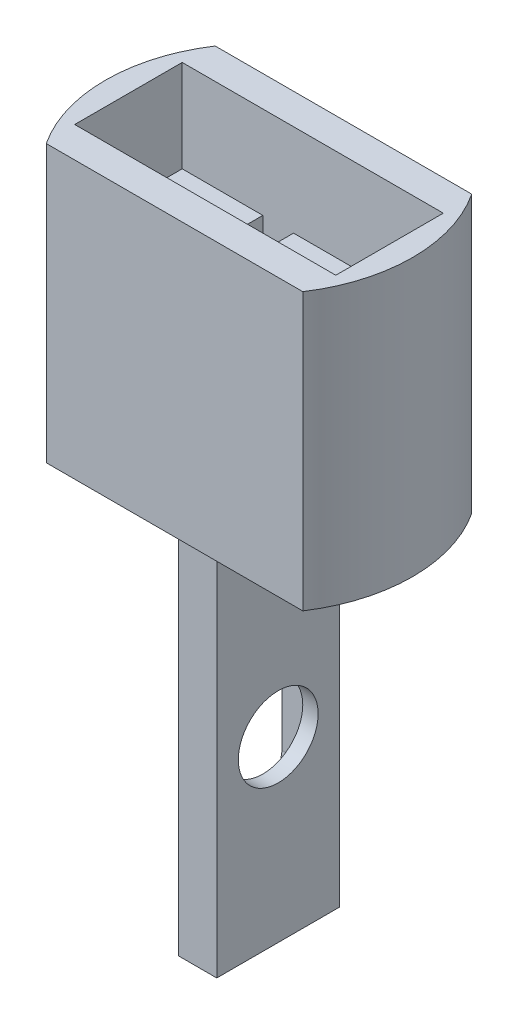
ISO-10303-21;
HEADER;
FILE_DESCRIPTION(('STEP AP214'),'2;1');
FILE_NAME('part.step','',(''),(''),'','','');
FILE_SCHEMA(('AUTOMOTIVE_DESIGN { 1 0 10303 214 1 1 1 1 }'));
ENDSEC;
DATA;
#1=APPLICATION_CONTEXT('core data for automotive mechanical design processes');
#2=APPLICATION_PROTOCOL_DEFINITION('international standard','automotive_design',2000,#1);
#3=PRODUCT_CONTEXT('',#1,'mechanical');
#4=PRODUCT('Part','Part','',(#3));
#5=PRODUCT_RELATED_PRODUCT_CATEGORY('part','',(#4));
#6=PRODUCT_DEFINITION_FORMATION('','',#4);
#7=PRODUCT_DEFINITION_CONTEXT('part definition',#1,'design');
#8=PRODUCT_DEFINITION('design','',#6,#7);
#9=PRODUCT_DEFINITION_SHAPE('','',#8);
#10=(LENGTH_UNIT() NAMED_UNIT(*) SI_UNIT(.MILLI.,.METRE.));
#11=(NAMED_UNIT(*) PLANE_ANGLE_UNIT() SI_UNIT($,.RADIAN.));
#12=(NAMED_UNIT(*) SI_UNIT($,.STERADIAN.) SOLID_ANGLE_UNIT());
#13=UNCERTAINTY_MEASURE_WITH_UNIT(LENGTH_MEASURE(1.E-05),#10,'distance_accuracy_value','');
#14=(GEOMETRIC_REPRESENTATION_CONTEXT(3) GLOBAL_UNCERTAINTY_ASSIGNED_CONTEXT((#13)) GLOBAL_UNIT_ASSIGNED_CONTEXT((#10,
#11,#12)) REPRESENTATION_CONTEXT('',''));
#15=CARTESIAN_POINT('',(0.,0.,0.));
#16=DIRECTION('',(0.,0.,1.));
#17=DIRECTION('',(1.,0.,0.));
#18=AXIS2_PLACEMENT_3D('',#15,#16,#17);
#19=CARTESIAN_POINT('',(0.249999999999999,-2.9,2.75));
#20=DIRECTION('',(0.,1.,0.));
#21=DIRECTION('',(0.,0.,1.));
#22=AXIS2_PLACEMENT_3D('',#19,#20,#21);
#23=PLANE('',#22);
#24=DIRECTION('',(0.,0.,-1.));
#25=VECTOR('',#24,1.);
#26=CARTESIAN_POINT('',(-1.25,-2.9,2.75));
#27=LINE('',#26,#25);
#28=CARTESIAN_POINT('',(-1.25,-2.9,1.49997066480721));
#29=VERTEX_POINT('',#28);
#30=CARTESIAN_POINT('',(-1.25,-2.9,-1.49997066480721));
#31=VERTEX_POINT('',#30);
#32=EDGE_CURVE('E64',#29,#31,#27,.T.);
#33=ORIENTED_EDGE('',*,*,#32,.T.);
#34=DIRECTION('',(-1.,0.,0.));
#35=VECTOR('',#34,1.);
#36=CARTESIAN_POINT('',(0.249999999999999,-2.9,-1.49997066480721));
#37=LINE('',#36,#35);
#38=CARTESIAN_POINT('',(0.249999999999999,-2.9,-1.49997066480721));
#39=VERTEX_POINT('',#38);
#40=EDGE_CURVE('E277',#39,#31,#37,.T.);
#41=ORIENTED_EDGE('',*,*,#40,.F.);
#42=DIRECTION('',(0.,0.,-1.));
#43=VECTOR('',#42,1.);
#44=CARTESIAN_POINT('',(0.249999999999999,-2.9,2.75));
#45=LINE('',#44,#43);
#46=CARTESIAN_POINT('',(0.249999999999999,-2.9,1.49997066480721));
#47=VERTEX_POINT('',#46);
#48=EDGE_CURVE('E405',#47,#39,#45,.T.);
#49=ORIENTED_EDGE('',*,*,#48,.F.);
#50=DIRECTION('',(-1.,0.,0.));
#51=VECTOR('',#50,1.);
#52=CARTESIAN_POINT('',(0.249999999999999,-2.9,1.49997066480721));
#53=LINE('',#52,#51);
#54=EDGE_CURVE('E305',#47,#29,#53,.T.);
#55=ORIENTED_EDGE('',*,*,#54,.T.);
#56=EDGE_LOOP('',(#33,#41,#49,#55));
#57=FACE_BOUND('',#56,.T.);
#58=ADVANCED_FACE('F40',(#57),#23,.F.);
#59=CARTESIAN_POINT('',(-1.25,-2.9,2.75));
#60=VERTEX_POINT('',#59);
#61=CARTESIAN_POINT('',(-1.25,-2.9,2.7499706648072));
#62=VERTEX_POINT('',#61);
#63=EDGE_CURVE('E267',#60,#62,#27,.T.);
#64=ORIENTED_EDGE('',*,*,#63,.T.);
#65=DIRECTION('',(-1.,0.,0.));
#66=VECTOR('',#65,1.);
#67=CARTESIAN_POINT('',(0.249999999999999,-2.9,2.7499706648072));
#68=LINE('',#67,#66);
#69=CARTESIAN_POINT('',(0.249999999999999,-2.9,2.7499706648072));
#70=VERTEX_POINT('',#69);
#71=EDGE_CURVE('E312',#70,#62,#68,.T.);
#72=ORIENTED_EDGE('',*,*,#71,.F.);
#73=CARTESIAN_POINT('',(0.249999999999999,-2.9,2.75));
#74=VERTEX_POINT('',#73);
#75=EDGE_CURVE('E400',#74,#70,#45,.T.);
#76=ORIENTED_EDGE('',*,*,#75,.F.);
#77=DIRECTION('',(-1.,0.,0.));
#78=VECTOR('',#77,1.);
#79=CARTESIAN_POINT('',(0.249999999999999,-2.9,2.75));
#80=LINE('',#79,#78);
#81=EDGE_CURVE('E414',#74,#60,#80,.T.);
#82=ORIENTED_EDGE('',*,*,#81,.T.);
#83=EDGE_LOOP('',(#64,#72,#76,#82));
#84=FACE_BOUND('',#83,.T.);
#85=ADVANCED_FACE('F660',(#84),#23,.F.);
#86=CARTESIAN_POINT('',(0.249999999999999,-23.9,2.75));
#87=DIRECTION('',(0.,-1.,0.));
#88=DIRECTION('',(0.,0.,-1.));
#89=AXIS2_PLACEMENT_3D('',#86,#87,#88);
#90=PLANE('',#89);
#91=DIRECTION('',(0.,0.,1.));
#92=VECTOR('',#91,1.);
#93=CARTESIAN_POINT('',(-1.25,-23.9,2.75));
#94=LINE('',#93,#92);
#95=CARTESIAN_POINT('',(-1.25,-23.9,-1.49997066480721));
#96=VERTEX_POINT('',#95);
#97=CARTESIAN_POINT('',(-1.25,-23.9,1.49997066480721));
#98=VERTEX_POINT('',#97);
#99=EDGE_CURVE('E424',#96,#98,#94,.T.);
#100=ORIENTED_EDGE('',*,*,#99,.T.);
#101=DIRECTION('',(-1.,0.,0.));
#102=VECTOR('',#101,1.);
#103=CARTESIAN_POINT('',(0.249999999999999,-23.9,1.49997066480721));
#104=LINE('',#103,#102);
#105=CARTESIAN_POINT('',(0.249999999999999,-23.9,1.49997066480721));
#106=VERTEX_POINT('',#105);
#107=EDGE_CURVE('E331',#106,#98,#104,.T.);
#108=ORIENTED_EDGE('',*,*,#107,.F.);
#109=DIRECTION('',(0.,0.,1.));
#110=VECTOR('',#109,1.);
#111=CARTESIAN_POINT('',(0.249999999999999,-23.9,2.75));
#112=LINE('',#111,#110);
#113=CARTESIAN_POINT('',(0.249999999999999,-23.9,-1.49997066480721));
#114=VERTEX_POINT('',#113);
#115=EDGE_CURVE('E415',#114,#106,#112,.T.);
#116=ORIENTED_EDGE('',*,*,#115,.F.);
#117=DIRECTION('',(-1.,0.,0.));
#118=VECTOR('',#117,1.);
#119=CARTESIAN_POINT('',(0.249999999999999,-23.9,-1.49997066480721));
#120=LINE('',#119,#118);
#121=EDGE_CURVE('E358',#114,#96,#120,.T.);
#122=ORIENTED_EDGE('',*,*,#121,.T.);
#123=EDGE_LOOP('',(#100,#108,#116,#122));
#124=FACE_BOUND('',#123,.T.);
#125=ADVANCED_FACE('F630',(#124),#90,.F.);
#126=CARTESIAN_POINT('',(-1.25,-23.9,-2.75));
#127=VERTEX_POINT('',#126);
#128=CARTESIAN_POINT('',(-1.25,-23.9,-2.7499706648072));
#129=VERTEX_POINT('',#128);
#130=EDGE_CURVE('E399',#127,#129,#94,.T.);
#131=ORIENTED_EDGE('',*,*,#130,.T.);
#132=DIRECTION('',(-1.,0.,0.));
#133=VECTOR('',#132,1.);
#134=CARTESIAN_POINT('',(0.249999999999999,-23.9,-2.7499706648072));
#135=LINE('',#134,#133);
#136=CARTESIAN_POINT('',(0.249999999999999,-23.9,-2.7499706648072));
#137=VERTEX_POINT('',#136);
#138=EDGE_CURVE('E365',#137,#129,#135,.T.);
#139=ORIENTED_EDGE('',*,*,#138,.F.);
#140=CARTESIAN_POINT('',(0.249999999999999,-23.9,-2.75));
#141=VERTEX_POINT('',#140);
#142=EDGE_CURVE('E410',#141,#137,#112,.T.);
#143=ORIENTED_EDGE('',*,*,#142,.F.);
#144=DIRECTION('',(-1.,0.,0.));
#145=VECTOR('',#144,1.);
#146=CARTESIAN_POINT('',(0.249999999999999,-23.9,-2.75));
#147=LINE('',#146,#145);
#148=EDGE_CURVE('E430',#141,#127,#147,.T.);
#149=ORIENTED_EDGE('',*,*,#148,.T.);
#150=EDGE_LOOP('',(#131,#139,#143,#149));
#151=FACE_BOUND('',#150,.T.);
#152=ADVANCED_FACE('F619',(#151),#90,.F.);
#153=CARTESIAN_POINT('',(0.,18.,0.));
#154=DIRECTION('',(0.,-1.,0.));
#155=DIRECTION('',(0.,0.,-1.));
#156=AXIS2_PLACEMENT_3D('',#153,#154,#155);
#157=CYLINDRICAL_SURFACE('',#156,10.);
#158=CARTESIAN_POINT('',(0.,18.,0.));
#159=DIRECTION('',(0.,1.,0.));
#160=DIRECTION('',(0.,0.,1.));
#161=AXIS2_PLACEMENT_3D('',#158,#159,#160);
#162=CIRCLE('',#161,10.);
#163=CARTESIAN_POINT('',(-8.35164654424503,18.,-5.5));
#164=VERTEX_POINT('',#163);
#165=CARTESIAN_POINT('',(-8.35164654424503,18.,5.5));
#166=VERTEX_POINT('',#165);
#167=EDGE_CURVE('E575',#164,#166,#162,.T.);
#168=ORIENTED_EDGE('',*,*,#167,.F.);
#169=DIRECTION('',(0.,-1.,0.));
#170=VECTOR('',#169,1.);
#171=CARTESIAN_POINT('',(-8.35164654424503,43.,-5.5));
#172=LINE('',#171,#170);
#173=CARTESIAN_POINT('',(-8.35164654424503,0.,-5.5));
#174=VERTEX_POINT('',#173);
#175=EDGE_CURVE('E381',#164,#174,#172,.T.);
#176=ORIENTED_EDGE('',*,*,#175,.T.);
#177=CARTESIAN_POINT('',(0.,0.,0.));
#178=DIRECTION('',(0.,1.,0.));
#179=DIRECTION('',(0.,0.,1.));
#180=AXIS2_PLACEMENT_3D('',#177,#178,#179);
#181=CIRCLE('',#180,10.);
#182=CARTESIAN_POINT('',(-8.35164654424503,0.,5.5));
#183=VERTEX_POINT('',#182);
#184=EDGE_CURVE('E570',#174,#183,#181,.T.);
#185=ORIENTED_EDGE('',*,*,#184,.T.);
#186=DIRECTION('',(0.,-1.,0.));
#187=VECTOR('',#186,1.);
#188=CARTESIAN_POINT('',(-8.35164654424503,43.,5.5));
#189=LINE('',#188,#187);
#190=EDGE_CURVE('E389',#166,#183,#189,.T.);
#191=ORIENTED_EDGE('',*,*,#190,.F.);
#192=EDGE_LOOP('',(#168,#176,#185,#191));
#193=FACE_BOUND('',#192,.T.);
#194=ADVANCED_FACE('F594',(#193),#157,.T.);
#195=CARTESIAN_POINT('',(-10.001,-13.4,0.));
#196=DIRECTION('',(1.,0.,0.));
#197=DIRECTION('',(0.,0.,-1.));
#198=AXIS2_PLACEMENT_3D('',#195,#196,#197);
#199=CYLINDRICAL_SURFACE('',#198,2.6);
#200=CARTESIAN_POINT('',(1.25,-13.4,0.));
#201=DIRECTION('',(1.,0.,0.));
#202=DIRECTION('',(0.,0.,-1.));
#203=AXIS2_PLACEMENT_3D('',#200,#201,#202);
#204=CIRCLE('',#203,2.6);
#205=CARTESIAN_POINT('',(1.25,-13.4,-2.6));
#206=VERTEX_POINT('',#205);
#207=EDGE_CURVE('E512',#206,#206,#204,.T.);
#208=ORIENTED_EDGE('',*,*,#207,.T.);
#209=EDGE_LOOP('',(#208));
#210=FACE_BOUND('',#209,.T.);
#211=CARTESIAN_POINT('',(0.249999999999999,-13.4,0.));
#212=DIRECTION('',(-1.,0.,0.));
#213=DIRECTION('',(0.,0.,1.));
#214=AXIS2_PLACEMENT_3D('',#211,#212,#213);
#215=CIRCLE('',#214,2.6);
#216=CARTESIAN_POINT('',(0.249999999999998,-13.4,2.6));
#217=VERTEX_POINT('',#216);
#218=EDGE_CURVE('E429',#217,#217,#215,.F.);
#219=ORIENTED_EDGE('',*,*,#218,.F.);
#220=EDGE_LOOP('',(#219));
#221=FACE_BOUND('',#220,.T.);
#222=ADVANCED_FACE('F779',(#210,#221),#199,.F.);
#223=CARTESIAN_POINT('',(0.,12.,0.));
#224=DIRECTION('',(0.,-1.,0.));
#225=DIRECTION('',(0.,0.,-1.));
#226=AXIS2_PLACEMENT_3D('',#223,#224,#225);
#227=PLANE('',#226);
#228=DIRECTION('',(0.,0.,-1.));
#229=VECTOR('',#228,1.);
#230=CARTESIAN_POINT('',(-1.25,12.,-3.5));
#231=LINE('',#230,#229);
#232=CARTESIAN_POINT('',(-1.25,12.,3.5));
#233=VERTEX_POINT('',#232);
#234=CARTESIAN_POINT('',(-1.25,12.,-3.5));
#235=VERTEX_POINT('',#234);
#236=EDGE_CURVE('E457',#233,#235,#231,.T.);
#237=ORIENTED_EDGE('',*,*,#236,.F.);
#238=DIRECTION('',(1.,0.,0.));
#239=VECTOR('',#238,1.);
#240=CARTESIAN_POINT('',(-8.5,12.,3.5));
#241=LINE('',#240,#239);
#242=CARTESIAN_POINT('',(8.5,12.,3.5));
#243=VERTEX_POINT('',#242);
#244=EDGE_CURVE('E480',#233,#243,#241,.T.);
#245=ORIENTED_EDGE('',*,*,#244,.T.);
#246=DIRECTION('',(0.,0.,-1.));
#247=VECTOR('',#246,1.);
#248=CARTESIAN_POINT('',(8.5,12.,3.5));
#249=LINE('',#248,#247);
#250=CARTESIAN_POINT('',(8.5,12.,-3.5));
#251=VERTEX_POINT('',#250);
#252=EDGE_CURVE('E486',#243,#251,#249,.T.);
#253=ORIENTED_EDGE('',*,*,#252,.T.);
#254=DIRECTION('',(-1.,0.,0.));
#255=VECTOR('',#254,1.);
#256=CARTESIAN_POINT('',(-8.5,12.,-3.5));
#257=LINE('',#256,#255);
#258=EDGE_CURVE('E491',#251,#235,#257,.T.);
#259=ORIENTED_EDGE('',*,*,#258,.T.);
#260=EDGE_LOOP('',(#237,#245,#253,#259));
#261=FACE_BOUND('',#260,.T.);
#262=ADVANCED_FACE('F803',(#261),#227,.F.);
#263=DIRECTION('',(0.,0.,1.));
#264=VECTOR('',#263,1.);
#265=CARTESIAN_POINT('',(-3.25,12.,-3.5));
#266=LINE('',#265,#264);
#267=CARTESIAN_POINT('',(-3.25,12.,-3.5));
#268=VERTEX_POINT('',#267);
#269=CARTESIAN_POINT('',(-3.25,12.,3.5));
#270=VERTEX_POINT('',#269);
#271=EDGE_CURVE('E444',#268,#270,#266,.T.);
#272=ORIENTED_EDGE('',*,*,#271,.F.);
#273=CARTESIAN_POINT('',(-8.5,12.,-3.5));
#274=VERTEX_POINT('',#273);
#275=EDGE_CURVE('E490',#268,#274,#257,.T.);
#276=ORIENTED_EDGE('',*,*,#275,.T.);
#277=DIRECTION('',(0.,0.,1.));
#278=VECTOR('',#277,1.);
#279=CARTESIAN_POINT('',(-8.5,12.,3.5));
#280=LINE('',#279,#278);
#281=CARTESIAN_POINT('',(-8.5,12.,3.5));
#282=VERTEX_POINT('',#281);
#283=EDGE_CURVE('E476',#274,#282,#280,.T.);
#284=ORIENTED_EDGE('',*,*,#283,.T.);
#285=EDGE_CURVE('E482',#282,#270,#241,.T.);
#286=ORIENTED_EDGE('',*,*,#285,.T.);
#287=EDGE_LOOP('',(#272,#276,#284,#286));
#288=FACE_BOUND('',#287,.T.);
#289=ADVANCED_FACE('F770',(#288),#227,.F.);
#290=CARTESIAN_POINT('',(0.,0.,0.));
#291=DIRECTION('',(0.,1.,0.));
#292=DIRECTION('',(0.,0.,1.));
#293=AXIS2_PLACEMENT_3D('',#290,#291,#292);
#294=PLANE('',#293);
#295=ORIENTED_EDGE('',*,*,#184,.F.);
#296=DIRECTION('',(-1.,0.,0.));
#297=VECTOR('',#296,1.);
#298=CARTESIAN_POINT('',(8.35164654424503,0.,-5.5));
#299=LINE('',#298,#297);
#300=CARTESIAN_POINT('',(8.35164654424503,0.,-5.5));
#301=VERTEX_POINT('',#300);
#302=EDGE_CURVE('E376',#301,#174,#299,.T.);
#303=ORIENTED_EDGE('',*,*,#302,.F.);
#304=CARTESIAN_POINT('',(8.35164654424503,0.,5.5));
#305=VERTEX_POINT('',#304);
#306=EDGE_CURVE('E576',#305,#301,#181,.T.);
#307=ORIENTED_EDGE('',*,*,#306,.F.);
#308=DIRECTION('',(1.,0.,0.));
#309=VECTOR('',#308,1.);
#310=CARTESIAN_POINT('',(8.35164654424503,0.,5.5));
#311=LINE('',#310,#309);
#312=EDGE_CURVE('E369',#183,#305,#311,.T.);
#313=ORIENTED_EDGE('',*,*,#312,.F.);
#314=EDGE_LOOP('',(#295,#303,#307,#313));
#315=FACE_BOUND('',#314,.T.);
#316=DIRECTION('',(0.,0.,1.));
#317=VECTOR('',#316,1.);
#318=CARTESIAN_POINT('',(1.25,0.,-4.));
#319=LINE('',#318,#317);
#320=CARTESIAN_POINT('',(1.25,0.,-4.));
#321=VERTEX_POINT('',#320);
#322=CARTESIAN_POINT('',(1.25,0.,4.));
#323=VERTEX_POINT('',#322);
#324=EDGE_CURVE('E525',#321,#323,#319,.T.);
#325=ORIENTED_EDGE('',*,*,#324,.F.);
#326=DIRECTION('',(1.,0.,0.));
#327=VECTOR('',#326,1.);
#328=CARTESIAN_POINT('',(-1.25,0.,-4.));
#329=LINE('',#328,#327);
#330=CARTESIAN_POINT('',(-1.25,0.,-4.));
#331=VERTEX_POINT('',#330);
#332=EDGE_CURVE('E531',#331,#321,#329,.T.);
#333=ORIENTED_EDGE('',*,*,#332,.F.);
#334=DIRECTION('',(0.,0.,-1.));
#335=VECTOR('',#334,1.);
#336=CARTESIAN_POINT('',(-1.25,0.,-4.));
#337=LINE('',#336,#335);
#338=CARTESIAN_POINT('',(-1.25,0.,4.));
#339=VERTEX_POINT('',#338);
#340=EDGE_CURVE('E548',#339,#331,#337,.T.);
#341=ORIENTED_EDGE('',*,*,#340,.F.);
#342=DIRECTION('',(-1.,0.,0.));
#343=VECTOR('',#342,1.);
#344=CARTESIAN_POINT('',(-1.25,0.,4.));
#345=LINE('',#344,#343);
#346=EDGE_CURVE('E544',#323,#339,#345,.T.);
#347=ORIENTED_EDGE('',*,*,#346,.F.);
#348=EDGE_LOOP('',(#325,#333,#341,#347));
#349=FACE_BOUND('',#348,.T.);
#350=ADVANCED_FACE('F762',(#315,#349),#294,.F.);
#351=ORIENTED_EDGE('',*,*,#306,.T.);
#352=DIRECTION('',(0.,-1.,0.));
#353=VECTOR('',#352,1.);
#354=CARTESIAN_POINT('',(8.35164654424503,43.,-5.5));
#355=LINE('',#354,#353);
#356=CARTESIAN_POINT('',(8.35164654424503,18.,-5.5));
#357=VERTEX_POINT('',#356);
#358=EDGE_CURVE('E379',#357,#301,#355,.T.);
#359=ORIENTED_EDGE('',*,*,#358,.F.);
#360=CARTESIAN_POINT('',(8.35164654424503,18.,5.5));
#361=VERTEX_POINT('',#360);
#362=EDGE_CURVE('E571',#361,#357,#162,.T.);
#363=ORIENTED_EDGE('',*,*,#362,.F.);
#364=DIRECTION('',(0.,-1.,0.));
#365=VECTOR('',#364,1.);
#366=CARTESIAN_POINT('',(8.35164654424503,43.,5.5));
#367=LINE('',#366,#365);
#368=EDGE_CURVE('E380',#361,#305,#367,.T.);
#369=ORIENTED_EDGE('',*,*,#368,.T.);
#370=EDGE_LOOP('',(#351,#359,#363,#369));
#371=FACE_BOUND('',#370,.T.);
#372=ADVANCED_FACE('F42',(#371),#157,.T.);
#373=CARTESIAN_POINT('',(0.,18.,0.));
#374=DIRECTION('',(0.,1.,0.));
#375=DIRECTION('',(0.,0.,1.));
#376=AXIS2_PLACEMENT_3D('',#373,#374,#375);
#377=PLANE('',#376);
#378=DIRECTION('',(1.,0.,0.));
#379=VECTOR('',#378,1.);
#380=CARTESIAN_POINT('',(0.,18.,-5.5));
#381=LINE('',#380,#379);
#382=EDGE_CURVE('E12',#164,#357,#381,.T.);
#383=ORIENTED_EDGE('',*,*,#382,.F.);
#384=ORIENTED_EDGE('',*,*,#167,.T.);
#385=DIRECTION('',(-1.,0.,0.));
#386=VECTOR('',#385,1.);
#387=CARTESIAN_POINT('',(0.,18.,5.5));
#388=LINE('',#387,#386);
#389=EDGE_CURVE('E49',#361,#166,#388,.T.);
#390=ORIENTED_EDGE('',*,*,#389,.F.);
#391=ORIENTED_EDGE('',*,*,#362,.T.);
#392=EDGE_LOOP('',(#383,#384,#390,#391));
#393=FACE_BOUND('',#392,.T.);
#394=DIRECTION('',(0.,0.,1.));
#395=VECTOR('',#394,1.);
#396=CARTESIAN_POINT('',(-8.5,18.,3.5));
#397=LINE('',#396,#395);
#398=CARTESIAN_POINT('',(-8.5,18.,-3.5));
#399=VERTEX_POINT('',#398);
#400=CARTESIAN_POINT('',(-8.5,18.,3.5));
#401=VERTEX_POINT('',#400);
#402=EDGE_CURVE('E467',#399,#401,#397,.T.);
#403=ORIENTED_EDGE('',*,*,#402,.F.);
#404=DIRECTION('',(-1.,0.,0.));
#405=VECTOR('',#404,1.);
#406=CARTESIAN_POINT('',(-8.5,18.,-3.5));
#407=LINE('',#406,#405);
#408=CARTESIAN_POINT('',(8.5,18.,-3.5));
#409=VERTEX_POINT('',#408);
#410=EDGE_CURVE('E481',#409,#399,#407,.T.);
#411=ORIENTED_EDGE('',*,*,#410,.F.);
#412=DIRECTION('',(0.,0.,-1.));
#413=VECTOR('',#412,1.);
#414=CARTESIAN_POINT('',(8.5,18.,3.5));
#415=LINE('',#414,#413);
#416=CARTESIAN_POINT('',(8.5,18.,3.5));
#417=VERTEX_POINT('',#416);
#418=EDGE_CURVE('E502',#417,#409,#415,.T.);
#419=ORIENTED_EDGE('',*,*,#418,.F.);
#420=DIRECTION('',(1.,0.,0.));
#421=VECTOR('',#420,1.);
#422=CARTESIAN_POINT('',(-8.5,18.,3.5));
#423=LINE('',#422,#421);
#424=EDGE_CURVE('E498',#401,#417,#423,.T.);
#425=ORIENTED_EDGE('',*,*,#424,.F.);
#426=EDGE_LOOP('',(#403,#411,#419,#425));
#427=FACE_BOUND('',#426,.T.);
#428=ADVANCED_FACE('F597',(#393,#427),#377,.T.);
#429=CARTESIAN_POINT('',(1.25,-25.,-4.));
#430=DIRECTION('',(-1.,0.,0.));
#431=DIRECTION('',(0.,0.,1.));
#432=AXIS2_PLACEMENT_3D('',#429,#430,#431);
#433=PLANE('',#432);
#434=ORIENTED_EDGE('',*,*,#207,.F.);
#435=EDGE_LOOP('',(#434));
#436=FACE_BOUND('',#435,.T.);
#437=ORIENTED_EDGE('',*,*,#324,.T.);
#438=DIRECTION('',(0.,1.,0.));
#439=VECTOR('',#438,1.);
#440=CARTESIAN_POINT('',(1.25,-25.,4.));
#441=LINE('',#440,#439);
#442=CARTESIAN_POINT('',(1.25,-25.,4.));
#443=VERTEX_POINT('',#442);
#444=EDGE_CURVE('E566',#443,#323,#441,.T.);
#445=ORIENTED_EDGE('',*,*,#444,.F.);
#446=DIRECTION('',(0.,0.,1.));
#447=VECTOR('',#446,1.);
#448=CARTESIAN_POINT('',(1.25,-25.,-4.));
#449=LINE('',#448,#447);
#450=CARTESIAN_POINT('',(1.25,-25.,-4.));
#451=VERTEX_POINT('',#450);
#452=EDGE_CURVE('E526',#451,#443,#449,.T.);
#453=ORIENTED_EDGE('',*,*,#452,.F.);
#454=DIRECTION('',(0.,1.,0.));
#455=VECTOR('',#454,1.);
#456=CARTESIAN_POINT('',(1.25,-25.,-4.));
#457=LINE('',#456,#455);
#458=EDGE_CURVE('E540',#451,#321,#457,.T.);
#459=ORIENTED_EDGE('',*,*,#458,.T.);
#460=EDGE_LOOP('',(#437,#445,#453,#459));
#461=FACE_BOUND('',#460,.T.);
#462=ADVANCED_FACE('F751',(#436,#461),#433,.F.);
#463=CARTESIAN_POINT('',(-1.25,-25.,4.));
#464=DIRECTION('',(0.,0.,-1.));
#465=DIRECTION('',(-1.,0.,0.));
#466=AXIS2_PLACEMENT_3D('',#463,#464,#465);
#467=PLANE('',#466);
#468=ORIENTED_EDGE('',*,*,#346,.T.);
#469=DIRECTION('',(0.,1.,0.));
#470=VECTOR('',#469,1.);
#471=CARTESIAN_POINT('',(-1.25,-25.,4.));
#472=LINE('',#471,#470);
#473=CARTESIAN_POINT('',(-1.25,-25.,4.));
#474=VERTEX_POINT('',#473);
#475=EDGE_CURVE('E562',#474,#339,#472,.T.);
#476=ORIENTED_EDGE('',*,*,#475,.F.);
#477=DIRECTION('',(-1.,0.,0.));
#478=VECTOR('',#477,1.);
#479=CARTESIAN_POINT('',(-1.25,-25.,4.));
#480=LINE('',#479,#478);
#481=EDGE_CURVE('E530',#443,#474,#480,.T.);
#482=ORIENTED_EDGE('',*,*,#481,.F.);
#483=ORIENTED_EDGE('',*,*,#444,.T.);
#484=EDGE_LOOP('',(#468,#476,#482,#483));
#485=FACE_BOUND('',#484,.T.);
#486=ADVANCED_FACE('F901',(#485),#467,.F.);
#487=CARTESIAN_POINT('',(-1.25,-25.,-4.));
#488=DIRECTION('',(1.,0.,0.));
#489=DIRECTION('',(0.,0.,-1.));
#490=AXIS2_PLACEMENT_3D('',#487,#488,#489);
#491=PLANE('',#490);
#492=ORIENTED_EDGE('',*,*,#63,.F.);
#493=DIRECTION('',(0.,1.,0.));
#494=VECTOR('',#493,1.);
#495=CARTESIAN_POINT('',(-1.25,-23.9,2.75));
#496=LINE('',#495,#494);
#497=CARTESIAN_POINT('',(-1.25,-23.9,2.75));
#498=VERTEX_POINT('',#497);
#499=EDGE_CURVE('E265',#498,#60,#496,.T.);
#500=ORIENTED_EDGE('',*,*,#499,.F.);
#501=CARTESIAN_POINT('',(-1.25,-23.9,2.7499706648072));
#502=VERTEX_POINT('',#501);
#503=EDGE_CURVE('E421',#502,#498,#94,.T.);
#504=ORIENTED_EDGE('',*,*,#503,.F.);
#505=DIRECTION('',(0.,1.,0.));
#506=VECTOR('',#505,1.);
#507=CARTESIAN_POINT('',(-1.25,-23.9,2.7499706648072));
#508=LINE('',#507,#506);
#509=CARTESIAN_POINT('',(-1.25,-16.8,2.74997066480719));
#510=VERTEX_POINT('',#509);
#511=EDGE_CURVE('E327',#502,#510,#508,.T.);
#512=ORIENTED_EDGE('',*,*,#511,.T.);
#513=DIRECTION('',(0.,-0.984853300679229,-0.173389665612539));
#514=VECTOR('',#513,1.);
#515=CARTESIAN_POINT('',(-1.25,-16.8,2.74997066480719));
#516=LINE('',#515,#514);
#517=EDGE_CURVE('E316',#510,#98,#516,.T.);
#518=ORIENTED_EDGE('',*,*,#517,.T.);
#519=ORIENTED_EDGE('',*,*,#99,.F.);
#520=DIRECTION('',(0.,0.984853300679229,-0.173389665612539));
#521=VECTOR('',#520,1.);
#522=CARTESIAN_POINT('',(-1.25,-16.8,-2.7499706648072));
#523=LINE('',#522,#521);
#524=CARTESIAN_POINT('',(-1.25,-16.8,-2.7499706648072));
#525=VERTEX_POINT('',#524);
#526=EDGE_CURVE('E341',#96,#525,#523,.T.);
#527=ORIENTED_EDGE('',*,*,#526,.T.);
#528=DIRECTION('',(0.,-1.,0.));
#529=VECTOR('',#528,1.);
#530=CARTESIAN_POINT('',(-1.25,-23.9,-2.7499706648072));
#531=LINE('',#530,#529);
#532=EDGE_CURVE('E354',#525,#129,#531,.T.);
#533=ORIENTED_EDGE('',*,*,#532,.T.);
#534=ORIENTED_EDGE('',*,*,#130,.F.);
#535=DIRECTION('',(0.,-1.,0.));
#536=VECTOR('',#535,1.);
#537=CARTESIAN_POINT('',(-1.25,-23.9,-2.75));
#538=LINE('',#537,#536);
#539=CARTESIAN_POINT('',(-1.25,-2.9,-2.75));
#540=VERTEX_POINT('',#539);
#541=EDGE_CURVE('E260',#540,#127,#538,.T.);
#542=ORIENTED_EDGE('',*,*,#541,.F.);
#543=CARTESIAN_POINT('',(-1.25,-2.9,-2.7499706648072));
#544=VERTEX_POINT('',#543);
#545=EDGE_CURVE('E250',#544,#540,#27,.T.);
#546=ORIENTED_EDGE('',*,*,#545,.F.);
#547=DIRECTION('',(0.,-1.,0.));
#548=VECTOR('',#547,1.);
#549=CARTESIAN_POINT('',(-1.25,-2.9,-2.7499706648072));
#550=LINE('',#549,#548);
#551=CARTESIAN_POINT('',(-1.25,-9.99999999999999,-2.7499706648072));
#552=VERTEX_POINT('',#551);
#553=EDGE_CURVE('E257',#544,#552,#550,.T.);
#554=ORIENTED_EDGE('',*,*,#553,.T.);
#555=DIRECTION('',(0.,0.984853300679229,0.173389665612539));
#556=VECTOR('',#555,1.);
#557=CARTESIAN_POINT('',(-1.25,-9.99999999999999,-2.7499706648072));
#558=LINE('',#557,#556);
#559=EDGE_CURVE('E282',#552,#31,#558,.T.);
#560=ORIENTED_EDGE('',*,*,#559,.T.);
#561=ORIENTED_EDGE('',*,*,#32,.F.);
#562=DIRECTION('',(0.,-0.984853300679229,0.173389665612538));
#563=VECTOR('',#562,1.);
#564=CARTESIAN_POINT('',(-1.25,-9.99999999999999,2.74997066480719));
#565=LINE('',#564,#563);
#566=CARTESIAN_POINT('',(-1.25,-9.99999999999999,2.74997066480719));
#567=VERTEX_POINT('',#566);
#568=EDGE_CURVE('E292',#29,#567,#565,.T.);
#569=ORIENTED_EDGE('',*,*,#568,.T.);
#570=DIRECTION('',(0.,1.,0.));
#571=VECTOR('',#570,1.);
#572=CARTESIAN_POINT('',(-1.25,-2.9,2.7499706648072));
#573=LINE('',#572,#571);
#574=EDGE_CURVE('E301',#567,#62,#573,.T.);
#575=ORIENTED_EDGE('',*,*,#574,.T.);
#576=EDGE_LOOP('',(#492,#500,#504,#512,#518,#519,#527,#533,#534,#542,#546,#554,#560,#561,#569,#575));
#577=FACE_BOUND('',#576,.T.);
#578=ORIENTED_EDGE('',*,*,#340,.T.);
#579=DIRECTION('',(0.,1.,0.));
#580=VECTOR('',#579,1.);
#581=CARTESIAN_POINT('',(-1.25,-25.,-4.));
#582=LINE('',#581,#580);
#583=CARTESIAN_POINT('',(-1.25,-25.,-4.));
#584=VERTEX_POINT('',#583);
#585=EDGE_CURVE('E558',#584,#331,#582,.T.);
#586=ORIENTED_EDGE('',*,*,#585,.F.);
#587=DIRECTION('',(0.,0.,-1.));
#588=VECTOR('',#587,1.);
#589=CARTESIAN_POINT('',(-1.25,-25.,-4.));
#590=LINE('',#589,#588);
#591=EDGE_CURVE('E534',#474,#584,#590,.T.);
#592=ORIENTED_EDGE('',*,*,#591,.F.);
#593=ORIENTED_EDGE('',*,*,#475,.T.);
#594=EDGE_LOOP('',(#578,#586,#592,#593));
#595=FACE_BOUND('',#594,.T.);
#596=ADVANCED_FACE('F253',(#577,#595),#491,.F.);
#597=CARTESIAN_POINT('',(-1.25,-25.,-4.));
#598=DIRECTION('',(0.,0.,1.));
#599=DIRECTION('',(1.,0.,0.));
#600=AXIS2_PLACEMENT_3D('',#597,#598,#599);
#601=PLANE('',#600);
#602=ORIENTED_EDGE('',*,*,#332,.T.);
#603=ORIENTED_EDGE('',*,*,#458,.F.);
#604=DIRECTION('',(1.,0.,0.));
#605=VECTOR('',#604,1.);
#606=CARTESIAN_POINT('',(-1.25,-25.,-4.));
#607=LINE('',#606,#605);
#608=EDGE_CURVE('E537',#584,#451,#607,.T.);
#609=ORIENTED_EDGE('',*,*,#608,.F.);
#610=ORIENTED_EDGE('',*,*,#585,.T.);
#611=EDGE_LOOP('',(#602,#603,#609,#610));
#612=FACE_BOUND('',#611,.T.);
#613=ADVANCED_FACE('F911',(#612),#601,.F.);
#614=CARTESIAN_POINT('',(0.,-25.,0.));
#615=DIRECTION('',(0.,1.,0.));
#616=DIRECTION('',(0.,0.,1.));
#617=AXIS2_PLACEMENT_3D('',#614,#615,#616);
#618=PLANE('',#617);
#619=ORIENTED_EDGE('',*,*,#452,.T.);
#620=ORIENTED_EDGE('',*,*,#481,.T.);
#621=ORIENTED_EDGE('',*,*,#591,.T.);
#622=ORIENTED_EDGE('',*,*,#608,.T.);
#623=EDGE_LOOP('',(#619,#620,#621,#622));
#624=FACE_BOUND('',#623,.T.);
#625=ADVANCED_FACE('F891',(#624),#618,.F.);
#626=CARTESIAN_POINT('',(-8.5,12.,3.5));
#627=DIRECTION('',(-1.,0.,0.));
#628=DIRECTION('',(0.,0.,1.));
#629=AXIS2_PLACEMENT_3D('',#626,#627,#628);
#630=PLANE('',#629);
#631=ORIENTED_EDGE('',*,*,#402,.T.);
#632=DIRECTION('',(0.,1.,0.));
#633=VECTOR('',#632,1.);
#634=CARTESIAN_POINT('',(-8.5,12.,3.5));
#635=LINE('',#634,#633);
#636=EDGE_CURVE('E495',#282,#401,#635,.T.);
#637=ORIENTED_EDGE('',*,*,#636,.F.);
#638=ORIENTED_EDGE('',*,*,#283,.F.);
#639=DIRECTION('',(0.,1.,0.));
#640=VECTOR('',#639,1.);
#641=CARTESIAN_POINT('',(-8.5,12.,-3.5));
#642=LINE('',#641,#640);
#643=EDGE_CURVE('E509',#274,#399,#642,.T.);
#644=ORIENTED_EDGE('',*,*,#643,.T.);
#645=EDGE_LOOP('',(#631,#637,#638,#644));
#646=FACE_BOUND('',#645,.T.);
#647=ADVANCED_FACE('F857',(#646),#630,.F.);
#648=CARTESIAN_POINT('',(-8.5,12.,-3.5));
#649=DIRECTION('',(0.,0.,-1.));
#650=DIRECTION('',(-1.,0.,0.));
#651=AXIS2_PLACEMENT_3D('',#648,#649,#650);
#652=PLANE('',#651);
#653=ORIENTED_EDGE('',*,*,#410,.T.);
#654=ORIENTED_EDGE('',*,*,#643,.F.);
#655=ORIENTED_EDGE('',*,*,#275,.F.);
#656=DIRECTION('',(0.,1.,0.));
#657=VECTOR('',#656,1.);
#658=CARTESIAN_POINT('',(-3.25,8.,-3.5));
#659=LINE('',#658,#657);
#660=CARTESIAN_POINT('',(-3.25,8.,-3.5));
#661=VERTEX_POINT('',#660);
#662=EDGE_CURVE('E471',#661,#268,#659,.T.);
#663=ORIENTED_EDGE('',*,*,#662,.F.);
#664=DIRECTION('',(-1.,0.,0.));
#665=VECTOR('',#664,1.);
#666=CARTESIAN_POINT('',(-1.25,8.,-3.5));
#667=LINE('',#666,#665);
#668=CARTESIAN_POINT('',(-1.25,8.,-3.5));
#669=VERTEX_POINT('',#668);
#670=EDGE_CURVE('E443',#669,#661,#667,.T.);
#671=ORIENTED_EDGE('',*,*,#670,.F.);
#672=DIRECTION('',(0.,1.,0.));
#673=VECTOR('',#672,1.);
#674=CARTESIAN_POINT('',(-1.25,8.,-3.5));
#675=LINE('',#674,#673);
#676=EDGE_CURVE('E456',#669,#235,#675,.T.);
#677=ORIENTED_EDGE('',*,*,#676,.T.);
#678=ORIENTED_EDGE('',*,*,#258,.F.);
#679=DIRECTION('',(0.,1.,0.));
#680=VECTOR('',#679,1.);
#681=CARTESIAN_POINT('',(8.5,12.,-3.5));
#682=LINE('',#681,#680);
#683=EDGE_CURVE('E513',#251,#409,#682,.T.);
#684=ORIENTED_EDGE('',*,*,#683,.T.);
#685=EDGE_LOOP('',(#653,#654,#655,#663,#671,#677,#678,#684));
#686=FACE_BOUND('',#685,.T.);
#687=ADVANCED_FACE('F853',(#686),#652,.F.);
#688=CARTESIAN_POINT('',(8.5,12.,3.5));
#689=DIRECTION('',(1.,0.,0.));
#690=DIRECTION('',(0.,0.,-1.));
#691=AXIS2_PLACEMENT_3D('',#688,#689,#690);
#692=PLANE('',#691);
#693=ORIENTED_EDGE('',*,*,#418,.T.);
#694=ORIENTED_EDGE('',*,*,#683,.F.);
#695=ORIENTED_EDGE('',*,*,#252,.F.);
#696=DIRECTION('',(0.,1.,0.));
#697=VECTOR('',#696,1.);
#698=CARTESIAN_POINT('',(8.5,12.,3.5));
#699=LINE('',#698,#697);
#700=EDGE_CURVE('E516',#243,#417,#699,.T.);
#701=ORIENTED_EDGE('',*,*,#700,.T.);
#702=EDGE_LOOP('',(#693,#694,#695,#701));
#703=FACE_BOUND('',#702,.T.);
#704=ADVANCED_FACE('F844',(#703),#692,.F.);
#705=CARTESIAN_POINT('',(-8.5,12.,3.5));
#706=DIRECTION('',(0.,0.,1.));
#707=DIRECTION('',(1.,0.,0.));
#708=AXIS2_PLACEMENT_3D('',#705,#706,#707);
#709=PLANE('',#708);
#710=ORIENTED_EDGE('',*,*,#424,.T.);
#711=ORIENTED_EDGE('',*,*,#700,.F.);
#712=ORIENTED_EDGE('',*,*,#244,.F.);
#713=DIRECTION('',(0.,1.,0.));
#714=VECTOR('',#713,1.);
#715=CARTESIAN_POINT('',(-1.25,8.,3.5));
#716=LINE('',#715,#714);
#717=CARTESIAN_POINT('',(-1.25,8.,3.5));
#718=VERTEX_POINT('',#717);
#719=EDGE_CURVE('E464',#718,#233,#716,.T.);
#720=ORIENTED_EDGE('',*,*,#719,.F.);
#721=DIRECTION('',(1.,0.,0.));
#722=VECTOR('',#721,1.);
#723=CARTESIAN_POINT('',(-1.25,8.,3.5));
#724=LINE('',#723,#722);
#725=CARTESIAN_POINT('',(-3.25,8.,3.5));
#726=VERTEX_POINT('',#725);
#727=EDGE_CURVE('E452',#726,#718,#724,.T.);
#728=ORIENTED_EDGE('',*,*,#727,.F.);
#729=DIRECTION('',(0.,1.,0.));
#730=VECTOR('',#729,1.);
#731=CARTESIAN_POINT('',(-3.25,8.,3.5));
#732=LINE('',#731,#730);
#733=EDGE_CURVE('E468',#726,#270,#732,.T.);
#734=ORIENTED_EDGE('',*,*,#733,.T.);
#735=ORIENTED_EDGE('',*,*,#285,.F.);
#736=ORIENTED_EDGE('',*,*,#636,.T.);
#737=EDGE_LOOP('',(#710,#711,#712,#720,#728,#734,#735,#736));
#738=FACE_BOUND('',#737,.T.);
#739=ADVANCED_FACE('F834',(#738),#709,.F.);
#740=CARTESIAN_POINT('',(-1.25,8.,-3.5));
#741=DIRECTION('',(1.,0.,0.));
#742=DIRECTION('',(0.,0.,-1.));
#743=AXIS2_PLACEMENT_3D('',#740,#741,#742);
#744=PLANE('',#743);
#745=ORIENTED_EDGE('',*,*,#236,.T.);
#746=ORIENTED_EDGE('',*,*,#676,.F.);
#747=DIRECTION('',(0.,0.,-1.));
#748=VECTOR('',#747,1.);
#749=CARTESIAN_POINT('',(-1.25,8.,-3.5));
#750=LINE('',#749,#748);
#751=EDGE_CURVE('E439',#718,#669,#750,.T.);
#752=ORIENTED_EDGE('',*,*,#751,.F.);
#753=ORIENTED_EDGE('',*,*,#719,.T.);
#754=EDGE_LOOP('',(#745,#746,#752,#753));
#755=FACE_BOUND('',#754,.T.);
#756=ADVANCED_FACE('F824',(#755),#744,.F.);
#757=CARTESIAN_POINT('',(-3.25,8.,-3.5));
#758=DIRECTION('',(-1.,0.,0.));
#759=DIRECTION('',(0.,0.,1.));
#760=AXIS2_PLACEMENT_3D('',#757,#758,#759);
#761=PLANE('',#760);
#762=ORIENTED_EDGE('',*,*,#271,.T.);
#763=ORIENTED_EDGE('',*,*,#733,.F.);
#764=DIRECTION('',(0.,0.,1.));
#765=VECTOR('',#764,1.);
#766=CARTESIAN_POINT('',(-3.25,8.,-3.5));
#767=LINE('',#766,#765);
#768=EDGE_CURVE('E448',#661,#726,#767,.T.);
#769=ORIENTED_EDGE('',*,*,#768,.F.);
#770=ORIENTED_EDGE('',*,*,#662,.T.);
#771=EDGE_LOOP('',(#762,#763,#769,#770));
#772=FACE_BOUND('',#771,.T.);
#773=ADVANCED_FACE('F814',(#772),#761,.F.);
#774=CARTESIAN_POINT('',(0.,8.,0.));
#775=DIRECTION('',(0.,-1.,0.));
#776=DIRECTION('',(0.,0.,-1.));
#777=AXIS2_PLACEMENT_3D('',#774,#775,#776);
#778=PLANE('',#777);
#779=ORIENTED_EDGE('',*,*,#751,.T.);
#780=ORIENTED_EDGE('',*,*,#670,.T.);
#781=ORIENTED_EDGE('',*,*,#768,.T.);
#782=ORIENTED_EDGE('',*,*,#727,.T.);
#783=EDGE_LOOP('',(#779,#780,#781,#782));
#784=FACE_BOUND('',#783,.T.);
#785=ADVANCED_FACE('F682',(#784),#778,.F.);
#786=CARTESIAN_POINT('',(0.249999999999999,0.,0.));
#787=DIRECTION('',(-1.,0.,0.));
#788=DIRECTION('',(0.,0.,1.));
#789=AXIS2_PLACEMENT_3D('',#786,#787,#788);
#790=PLANE('',#789);
#791=DIRECTION('',(0.,0.984853300679229,0.173389665612539));
#792=VECTOR('',#791,1.);
#793=CARTESIAN_POINT('',(0.249999999999999,-9.99999999999999,-2.7499706648072));
#794=LINE('',#793,#792);
#795=CARTESIAN_POINT('',(0.249999999999999,-9.99999999999999,-2.7499706648072));
#796=VERTEX_POINT('',#795);
#797=EDGE_CURVE('E56',#796,#39,#794,.T.);
#798=ORIENTED_EDGE('',*,*,#797,.F.);
#799=DIRECTION('',(0.,-1.,0.));
#800=VECTOR('',#799,1.);
#801=CARTESIAN_POINT('',(0.249999999999999,-2.9,-2.7499706648072));
#802=LINE('',#801,#800);
#803=CARTESIAN_POINT('',(0.249999999999999,-2.9,-2.7499706648072));
#804=VERTEX_POINT('',#803);
#805=EDGE_CURVE('E286',#804,#796,#802,.T.);
#806=ORIENTED_EDGE('',*,*,#805,.F.);
#807=CARTESIAN_POINT('',(0.249999999999999,-2.9,-2.75));
#808=VERTEX_POINT('',#807);
#809=EDGE_CURVE('E272',#804,#808,#45,.T.);
#810=ORIENTED_EDGE('',*,*,#809,.T.);
#811=DIRECTION('',(0.,-1.,0.));
#812=VECTOR('',#811,1.);
#813=CARTESIAN_POINT('',(0.249999999999999,-23.9,-2.75));
#814=LINE('',#813,#812);
#815=EDGE_CURVE('E404',#808,#141,#814,.T.);
#816=ORIENTED_EDGE('',*,*,#815,.T.);
#817=ORIENTED_EDGE('',*,*,#142,.T.);
#818=DIRECTION('',(0.,-1.,0.));
#819=VECTOR('',#818,1.);
#820=CARTESIAN_POINT('',(0.249999999999999,-23.9,-2.7499706648072));
#821=LINE('',#820,#819);
#822=CARTESIAN_POINT('',(0.249999999999999,-16.8,-2.7499706648072));
#823=VERTEX_POINT('',#822);
#824=EDGE_CURVE('E353',#823,#137,#821,.T.);
#825=ORIENTED_EDGE('',*,*,#824,.F.);
#826=DIRECTION('',(0.,0.984853300679229,-0.173389665612539));
#827=VECTOR('',#826,1.);
#828=CARTESIAN_POINT('',(0.249999999999999,-16.8,-2.7499706648072));
#829=LINE('',#828,#827);
#830=EDGE_CURVE('E349',#114,#823,#829,.T.);
#831=ORIENTED_EDGE('',*,*,#830,.F.);
#832=ORIENTED_EDGE('',*,*,#115,.T.);
#833=DIRECTION('',(0.,-0.984853300679229,-0.173389665612539));
#834=VECTOR('',#833,1.);
#835=CARTESIAN_POINT('',(0.249999999999999,-16.8,2.74997066480719));
#836=LINE('',#835,#834);
#837=CARTESIAN_POINT('',(0.249999999999999,-16.8,2.74997066480719));
#838=VERTEX_POINT('',#837);
#839=EDGE_CURVE('E322',#838,#106,#836,.T.);
#840=ORIENTED_EDGE('',*,*,#839,.F.);
#841=DIRECTION('',(0.,1.,0.));
#842=VECTOR('',#841,1.);
#843=CARTESIAN_POINT('',(0.249999999999999,-23.9,2.7499706648072));
#844=LINE('',#843,#842);
#845=CARTESIAN_POINT('',(0.249999999999999,-23.9,2.7499706648072));
#846=VERTEX_POINT('',#845);
#847=EDGE_CURVE('E326',#846,#838,#844,.T.);
#848=ORIENTED_EDGE('',*,*,#847,.F.);
#849=CARTESIAN_POINT('',(0.249999999999999,-23.9,2.75));
#850=VERTEX_POINT('',#849);
#851=EDGE_CURVE('E409',#846,#850,#112,.T.);
#852=ORIENTED_EDGE('',*,*,#851,.T.);
#853=DIRECTION('',(0.,1.,0.));
#854=VECTOR('',#853,1.);
#855=CARTESIAN_POINT('',(0.249999999999999,-23.9,2.75));
#856=LINE('',#855,#854);
#857=EDGE_CURVE('E395',#850,#74,#856,.T.);
#858=ORIENTED_EDGE('',*,*,#857,.T.);
#859=ORIENTED_EDGE('',*,*,#75,.T.);
#860=DIRECTION('',(0.,1.,0.));
#861=VECTOR('',#860,1.);
#862=CARTESIAN_POINT('',(0.249999999999999,-2.9,2.7499706648072));
#863=LINE('',#862,#861);
#864=CARTESIAN_POINT('',(0.249999999999999,-9.99999999999999,2.74997066480719));
#865=VERTEX_POINT('',#864);
#866=EDGE_CURVE('E300',#865,#70,#863,.T.);
#867=ORIENTED_EDGE('',*,*,#866,.F.);
#868=DIRECTION('',(0.,-0.984853300679229,0.173389665612538));
#869=VECTOR('',#868,1.);
#870=CARTESIAN_POINT('',(0.249999999999999,-9.99999999999999,2.74997066480719));
#871=LINE('',#870,#869);
#872=EDGE_CURVE('E296',#47,#865,#871,.T.);
#873=ORIENTED_EDGE('',*,*,#872,.F.);
#874=ORIENTED_EDGE('',*,*,#48,.T.);
#875=EDGE_LOOP('',(#798,#806,#810,#816,#817,#825,#831,#832,#840,#848,#852,#858,#859,#867,#873,#874));
#876=FACE_BOUND('',#875,.T.);
#877=ORIENTED_EDGE('',*,*,#218,.T.);
#878=EDGE_LOOP('',(#877));
#879=FACE_BOUND('',#878,.T.);
#880=ADVANCED_FACE('F612',(#876,#879),#790,.T.);
#881=CARTESIAN_POINT('',(0.249999999999999,-23.9,2.75));
#882=DIRECTION('',(0.,0.,1.));
#883=DIRECTION('',(1.,0.,0.));
#884=AXIS2_PLACEMENT_3D('',#881,#882,#883);
#885=PLANE('',#884);
#886=ORIENTED_EDGE('',*,*,#499,.T.);
#887=ORIENTED_EDGE('',*,*,#81,.F.);
#888=ORIENTED_EDGE('',*,*,#857,.F.);
#889=DIRECTION('',(-1.,0.,0.));
#890=VECTOR('',#889,1.);
#891=CARTESIAN_POINT('',(0.249999999999999,-23.9,2.75));
#892=LINE('',#891,#890);
#893=EDGE_CURVE('E425',#850,#498,#892,.T.);
#894=ORIENTED_EDGE('',*,*,#893,.T.);
#895=EDGE_LOOP('',(#886,#887,#888,#894));
#896=FACE_BOUND('',#895,.T.);
#897=ADVANCED_FACE('F646',(#896),#885,.F.);
#898=ORIENTED_EDGE('',*,*,#851,.F.);
#899=DIRECTION('',(-1.,0.,0.));
#900=VECTOR('',#899,1.);
#901=CARTESIAN_POINT('',(0.249999999999999,-23.9,2.7499706648072));
#902=LINE('',#901,#900);
#903=EDGE_CURVE('E342',#846,#502,#902,.T.);
#904=ORIENTED_EDGE('',*,*,#903,.T.);
#905=ORIENTED_EDGE('',*,*,#503,.T.);
#906=ORIENTED_EDGE('',*,*,#893,.F.);
#907=EDGE_LOOP('',(#898,#904,#905,#906));
#908=FACE_BOUND('',#907,.T.);
#909=ADVANCED_FACE('F643',(#908),#90,.F.);
#910=CARTESIAN_POINT('',(0.249999999999999,-23.9,-2.75));
#911=DIRECTION('',(0.,0.,-1.));
#912=DIRECTION('',(-1.,0.,0.));
#913=AXIS2_PLACEMENT_3D('',#910,#911,#912);
#914=PLANE('',#913);
#915=ORIENTED_EDGE('',*,*,#541,.T.);
#916=ORIENTED_EDGE('',*,*,#148,.F.);
#917=ORIENTED_EDGE('',*,*,#815,.F.);
#918=DIRECTION('',(-1.,0.,0.));
#919=VECTOR('',#918,1.);
#920=CARTESIAN_POINT('',(0.249999999999999,-2.9,-2.75));
#921=LINE('',#920,#919);
#922=EDGE_CURVE('E433',#808,#540,#921,.T.);
#923=ORIENTED_EDGE('',*,*,#922,.T.);
#924=EDGE_LOOP('',(#915,#916,#917,#923));
#925=FACE_BOUND('',#924,.T.);
#926=ADVANCED_FACE('F617',(#925),#914,.F.);
#927=ORIENTED_EDGE('',*,*,#809,.F.);
#928=DIRECTION('',(-1.,0.,0.));
#929=VECTOR('',#928,1.);
#930=CARTESIAN_POINT('',(0.249999999999999,-2.9,-2.7499706648072));
#931=LINE('',#930,#929);
#932=EDGE_CURVE('E270',#804,#544,#931,.T.);
#933=ORIENTED_EDGE('',*,*,#932,.T.);
#934=ORIENTED_EDGE('',*,*,#545,.T.);
#935=ORIENTED_EDGE('',*,*,#922,.F.);
#936=EDGE_LOOP('',(#927,#933,#934,#935));
#937=FACE_BOUND('',#936,.T.);
#938=ADVANCED_FACE('F271',(#937),#23,.F.);
#939=CARTESIAN_POINT('',(8.35164654424503,43.,5.5));
#940=DIRECTION('',(0.,0.,-1.));
#941=DIRECTION('',(-1.,0.,0.));
#942=AXIS2_PLACEMENT_3D('',#939,#940,#941);
#943=PLANE('',#942);
#944=ORIENTED_EDGE('',*,*,#389,.T.);
#945=ORIENTED_EDGE('',*,*,#190,.T.);
#946=ORIENTED_EDGE('',*,*,#312,.T.);
#947=ORIENTED_EDGE('',*,*,#368,.F.);
#948=EDGE_LOOP('',(#944,#945,#946,#947));
#949=FACE_BOUND('',#948,.T.);
#950=ADVANCED_FACE('F586',(#949),#943,.F.);
#951=CARTESIAN_POINT('',(8.35164654424503,43.,-5.5));
#952=DIRECTION('',(0.,0.,1.));
#953=DIRECTION('',(1.,0.,0.));
#954=AXIS2_PLACEMENT_3D('',#951,#952,#953);
#955=PLANE('',#954);
#956=ORIENTED_EDGE('',*,*,#382,.T.);
#957=ORIENTED_EDGE('',*,*,#358,.T.);
#958=ORIENTED_EDGE('',*,*,#302,.T.);
#959=ORIENTED_EDGE('',*,*,#175,.F.);
#960=EDGE_LOOP('',(#956,#957,#958,#959));
#961=FACE_BOUND('',#960,.T.);
#962=ADVANCED_FACE('F675',(#961),#955,.F.);
#963=CARTESIAN_POINT('',(0.249999999999999,-23.9,-2.7499706648072));
#964=DIRECTION('',(0.,0.,-1.));
#965=DIRECTION('',(-1.,0.,0.));
#966=AXIS2_PLACEMENT_3D('',#963,#964,#965);
#967=PLANE('',#966);
#968=ORIENTED_EDGE('',*,*,#532,.F.);
#969=DIRECTION('',(-1.,0.,0.));
#970=VECTOR('',#969,1.);
#971=CARTESIAN_POINT('',(0.249999999999999,-16.8,-2.7499706648072));
#972=LINE('',#971,#970);
#973=EDGE_CURVE('E370',#823,#525,#972,.T.);
#974=ORIENTED_EDGE('',*,*,#973,.F.);
#975=ORIENTED_EDGE('',*,*,#824,.T.);
#976=ORIENTED_EDGE('',*,*,#138,.T.);
#977=EDGE_LOOP('',(#968,#974,#975,#976));
#978=FACE_BOUND('',#977,.T.);
#979=ADVANCED_FACE('F623',(#978),#967,.T.);
#980=CARTESIAN_POINT('',(0.249999999999999,-16.8,-2.7499706648072));
#981=DIRECTION('',(0.,0.173389665612539,0.984853300679229));
#982=DIRECTION('',(0.,-0.984853300679229,0.173389665612539));
#983=AXIS2_PLACEMENT_3D('',#980,#981,#982);
#984=PLANE('',#983);
#985=ORIENTED_EDGE('',*,*,#526,.F.);
#986=ORIENTED_EDGE('',*,*,#121,.F.);
#987=ORIENTED_EDGE('',*,*,#830,.T.);
#988=ORIENTED_EDGE('',*,*,#973,.T.);
#989=EDGE_LOOP('',(#985,#986,#987,#988));
#990=FACE_BOUND('',#989,.T.);
#991=ADVANCED_FACE('F627',(#990),#984,.T.);
#992=CARTESIAN_POINT('',(0.249999999999999,-16.8,2.74997066480719));
#993=DIRECTION('',(0.,0.173389665612539,-0.984853300679229));
#994=DIRECTION('',(0.,0.984853300679229,0.173389665612539));
#995=AXIS2_PLACEMENT_3D('',#992,#993,#994);
#996=PLANE('',#995);
#997=ORIENTED_EDGE('',*,*,#517,.F.);
#998=DIRECTION('',(-1.,0.,0.));
#999=VECTOR('',#998,1.);
#1000=CARTESIAN_POINT('',(0.249999999999999,-16.8,2.74997066480719));
#1001=LINE('',#1000,#999);
#1002=EDGE_CURVE('E338',#838,#510,#1001,.T.);
#1003=ORIENTED_EDGE('',*,*,#1002,.F.);
#1004=ORIENTED_EDGE('',*,*,#839,.T.);
#1005=ORIENTED_EDGE('',*,*,#107,.T.);
#1006=EDGE_LOOP('',(#997,#1003,#1004,#1005));
#1007=FACE_BOUND('',#1006,.T.);
#1008=ADVANCED_FACE('F633',(#1007),#996,.T.);
#1009=CARTESIAN_POINT('',(0.249999999999999,-23.9,2.7499706648072));
#1010=DIRECTION('',(0.,0.,1.));
#1011=DIRECTION('',(0.,-1.,0.));
#1012=AXIS2_PLACEMENT_3D('',#1009,#1010,#1011);
#1013=PLANE('',#1012);
#1014=ORIENTED_EDGE('',*,*,#511,.F.);
#1015=ORIENTED_EDGE('',*,*,#903,.F.);
#1016=ORIENTED_EDGE('',*,*,#847,.T.);
#1017=ORIENTED_EDGE('',*,*,#1002,.T.);
#1018=EDGE_LOOP('',(#1014,#1015,#1016,#1017));
#1019=FACE_BOUND('',#1018,.T.);
#1020=ADVANCED_FACE('F639',(#1019),#1013,.T.);
#1021=CARTESIAN_POINT('',(0.249999999999999,-2.9,2.7499706648072));
#1022=DIRECTION('',(0.,0.,1.));
#1023=DIRECTION('',(0.,-1.,0.));
#1024=AXIS2_PLACEMENT_3D('',#1021,#1022,#1023);
#1025=PLANE('',#1024);
#1026=ORIENTED_EDGE('',*,*,#574,.F.);
#1027=DIRECTION('',(-1.,0.,0.));
#1028=VECTOR('',#1027,1.);
#1029=CARTESIAN_POINT('',(0.249999999999999,-9.99999999999999,2.74997066480719));
#1030=LINE('',#1029,#1028);
#1031=EDGE_CURVE('E317',#865,#567,#1030,.T.);
#1032=ORIENTED_EDGE('',*,*,#1031,.F.);
#1033=ORIENTED_EDGE('',*,*,#866,.T.);
#1034=ORIENTED_EDGE('',*,*,#71,.T.);
#1035=EDGE_LOOP('',(#1026,#1032,#1033,#1034));
#1036=FACE_BOUND('',#1035,.T.);
#1037=ADVANCED_FACE('F652',(#1036),#1025,.T.);
#1038=CARTESIAN_POINT('',(0.249999999999999,-9.99999999999999,2.74997066480719));
#1039=DIRECTION('',(0.,-0.173389665612538,-0.984853300679229));
#1040=DIRECTION('',(0.,0.984853300679229,-0.173389665612539));
#1041=AXIS2_PLACEMENT_3D('',#1038,#1039,#1040);
#1042=PLANE('',#1041);
#1043=ORIENTED_EDGE('',*,*,#568,.F.);
#1044=ORIENTED_EDGE('',*,*,#54,.F.);
#1045=ORIENTED_EDGE('',*,*,#872,.T.);
#1046=ORIENTED_EDGE('',*,*,#1031,.T.);
#1047=EDGE_LOOP('',(#1043,#1044,#1045,#1046));
#1048=FACE_BOUND('',#1047,.T.);
#1049=ADVANCED_FACE('F656',(#1048),#1042,.T.);
#1050=CARTESIAN_POINT('',(0.249999999999999,-9.99999999999999,-2.7499706648072));
#1051=DIRECTION('',(0.,-0.173389665612539,0.984853300679229));
#1052=DIRECTION('',(0.,-0.984853300679229,-0.173389665612539));
#1053=AXIS2_PLACEMENT_3D('',#1050,#1051,#1052);
#1054=PLANE('',#1053);
#1055=ORIENTED_EDGE('',*,*,#559,.F.);
#1056=DIRECTION('',(-1.,0.,0.));
#1057=VECTOR('',#1056,1.);
#1058=CARTESIAN_POINT('',(0.249999999999999,-9.99999999999999,-2.7499706648072));
#1059=LINE('',#1058,#1057);
#1060=EDGE_CURVE('E276',#796,#552,#1059,.T.);
#1061=ORIENTED_EDGE('',*,*,#1060,.F.);
#1062=ORIENTED_EDGE('',*,*,#797,.T.);
#1063=ORIENTED_EDGE('',*,*,#40,.T.);
#1064=EDGE_LOOP('',(#1055,#1061,#1062,#1063));
#1065=FACE_BOUND('',#1064,.T.);
#1066=ADVANCED_FACE('F659',(#1065),#1054,.T.);
#1067=CARTESIAN_POINT('',(0.249999999999999,-2.9,-2.7499706648072));
#1068=DIRECTION('',(0.,0.,-1.));
#1069=DIRECTION('',(-1.,0.,0.));
#1070=AXIS2_PLACEMENT_3D('',#1067,#1068,#1069);
#1071=PLANE('',#1070);
#1072=ORIENTED_EDGE('',*,*,#553,.F.);
#1073=ORIENTED_EDGE('',*,*,#932,.F.);
#1074=ORIENTED_EDGE('',*,*,#805,.T.);
#1075=ORIENTED_EDGE('',*,*,#1060,.T.);
#1076=EDGE_LOOP('',(#1072,#1073,#1074,#1075));
#1077=FACE_BOUND('',#1076,.T.);
#1078=ADVANCED_FACE('F279',(#1077),#1071,.T.);
#1079=CLOSED_SHELL('',(#58,#85,#125,#152,#194,#222,#262,#289,#350,#372,#428,#462,#486,#596,#613,
#625,#647,#687,#704,#739,#756,#773,#785,#880,#897,#909,#926,#938,#950,#962,#979,#991,#1008,
#1020,#1037,#1049,#1066,#1078));
#1080=MANIFOLD_SOLID_BREP('B2',#1079);
#1081=ADVANCED_BREP_SHAPE_REPRESENTATION('',(#18,#1080),#14);
#1082=SHAPE_DEFINITION_REPRESENTATION(#9,#1081);
ENDSEC;
END-ISO-10303-21;
